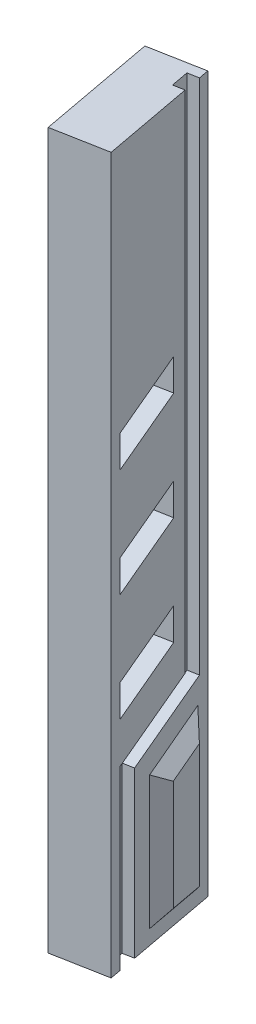
ISO-10303-21;
HEADER;
FILE_DESCRIPTION(('STEP AP214'),'2;1');
FILE_NAME('part.step','',(''),(''),'','','');
FILE_SCHEMA(('AUTOMOTIVE_DESIGN { 1 0 10303 214 1 1 1 1 }'));
ENDSEC;
DATA;
#1=APPLICATION_CONTEXT('core data for automotive mechanical design processes');
#2=APPLICATION_PROTOCOL_DEFINITION('international standard','automotive_design',2000,#1);
#3=PRODUCT_CONTEXT('',#1,'mechanical');
#4=PRODUCT('Part','Part','',(#3));
#5=PRODUCT_RELATED_PRODUCT_CATEGORY('part','',(#4));
#6=PRODUCT_DEFINITION_FORMATION('','',#4);
#7=PRODUCT_DEFINITION_CONTEXT('part definition',#1,'design');
#8=PRODUCT_DEFINITION('design','',#6,#7);
#9=PRODUCT_DEFINITION_SHAPE('','',#8);
#10=(LENGTH_UNIT() NAMED_UNIT(*) SI_UNIT(.MILLI.,.METRE.));
#11=(NAMED_UNIT(*) PLANE_ANGLE_UNIT() SI_UNIT($,.RADIAN.));
#12=(NAMED_UNIT(*) SI_UNIT($,.STERADIAN.) SOLID_ANGLE_UNIT());
#13=UNCERTAINTY_MEASURE_WITH_UNIT(LENGTH_MEASURE(1.E-05),#10,'distance_accuracy_value','');
#14=(GEOMETRIC_REPRESENTATION_CONTEXT(3) GLOBAL_UNCERTAINTY_ASSIGNED_CONTEXT((#13)) GLOBAL_UNIT_ASSIGNED_CONTEXT((#10,
#11,#12)) REPRESENTATION_CONTEXT('',''));
#15=CARTESIAN_POINT('',(0.,0.,0.));
#16=DIRECTION('',(0.,0.,1.));
#17=DIRECTION('',(1.,0.,0.));
#18=AXIS2_PLACEMENT_3D('',#15,#16,#17);
#19=CARTESIAN_POINT('',(-10.3753108958945,0.,1.93626512346388));
#20=DIRECTION('',(0.983028102298964,0.,-0.183455035609539));
#21=DIRECTION('',(-0.183455035609539,0.,-0.983028102298964));
#22=AXIS2_PLACEMENT_3D('',#19,#20,#21);
#23=PLANE('',#22);
#24=DIRECTION('',(0.,-1.,0.));
#25=VECTOR('',#24,1.);
#26=CARTESIAN_POINT('',(0.808929898637114,-71.6263536806701,61.8660619119441));
#27=LINE('',#26,#25);
#28=CARTESIAN_POINT('',(0.808929898637114,-71.6263536806701,61.8660619119441));
#29=VERTEX_POINT('',#28);
#30=CARTESIAN_POINT('',(0.808929898637114,-75.3266931643423,61.8660619119441));
#31=VERTEX_POINT('',#30);
#32=EDGE_CURVE('E362',#29,#31,#27,.T.);
#33=ORIENTED_EDGE('',*,*,#32,.F.);
#34=DIRECTION('',(0.169408129616689,-0.38376367434726,0.907758959124759));
#35=VECTOR('',#34,1.);
#36=CARTESIAN_POINT('',(0.501452632733804,-70.929819189626,60.2184713064492));
#37=LINE('',#36,#35);
#38=CARTESIAN_POINT('',(0.501452632733804,-70.929819189626,60.2184713064492));
#39=VERTEX_POINT('',#38);
#40=EDGE_CURVE('E291',#39,#29,#37,.T.);
#41=ORIENTED_EDGE('',*,*,#40,.F.);
#42=DIRECTION('',(0.,1.,0.));
#43=VECTOR('',#42,1.);
#44=CARTESIAN_POINT('',(0.501452632733804,-75.3266931643423,60.2184713064492));
#45=LINE('',#44,#43);
#46=CARTESIAN_POINT('',(0.5014526327338,-75.3266931643423,60.2184713064492));
#47=VERTEX_POINT('',#46);
#48=EDGE_CURVE('E367',#47,#39,#45,.T.);
#49=ORIENTED_EDGE('',*,*,#48,.F.);
#50=DIRECTION('',(-0.183455035609539,0.,-0.983028102298964));
#51=VECTOR('',#50,1.);
#52=CARTESIAN_POINT('',(0.808929898637114,-75.3266931643423,61.8660619119441));
#53=LINE('',#52,#51);
#54=EDGE_CURVE('E364',#31,#47,#53,.T.);
#55=ORIENTED_EDGE('',*,*,#54,.F.);
#56=EDGE_LOOP('',(#33,#41,#49,#55));
#57=FACE_BOUND('',#56,.T.);
#58=DIRECTION('',(0.,1.,0.));
#59=VECTOR('',#58,1.);
#60=CARTESIAN_POINT('',(0.438001001913638,-55.8609439533743,59.8784711749419));
#61=LINE('',#60,#59);
#62=CARTESIAN_POINT('',(0.438001001913636,-75.7345738792723,59.8784711749419));
#63=VERTEX_POINT('',#62);
#64=CARTESIAN_POINT('',(0.438001001913638,-55.8609439533743,59.8784711749419));
#65=VERTEX_POINT('',#64);
#66=EDGE_CURVE('E235',#63,#65,#61,.T.);
#67=ORIENTED_EDGE('',*,*,#66,.T.);
#68=DIRECTION('',(0.183455035609539,0.,0.983028102298964));
#69=VECTOR('',#68,1.);
#70=CARTESIAN_POINT('',(1.05418094169782,-55.8609439533743,63.1802186296694));
#71=LINE('',#70,#69);
#72=CARTESIAN_POINT('',(0.49073907438147,-55.8609439533743,60.161063621231));
#73=VERTEX_POINT('',#72);
#74=EDGE_CURVE('E241',#65,#73,#71,.T.);
#75=ORIENTED_EDGE('',*,*,#74,.T.);
#76=DIRECTION('',(0.,1.,0.));
#77=VECTOR('',#76,1.);
#78=CARTESIAN_POINT('',(0.49073907438147,-55.7109439533743,60.161063621231));
#79=LINE('',#78,#77);
#80=CARTESIAN_POINT('',(0.49073907438147,-70.2342206230719,60.161063621231));
#81=VERTEX_POINT('',#80);
#82=EDGE_CURVE('E392',#81,#73,#79,.T.);
#83=ORIENTED_EDGE('',*,*,#82,.F.);
#84=DIRECTION('',(-0.169825322901351,0.378245230076341,-0.909994453623728));
#85=VECTOR('',#84,1.);
#86=CARTESIAN_POINT('',(0.49073907438147,-70.2342206230719,60.161063621231));
#87=LINE('',#86,#85);
#88=CARTESIAN_POINT('',(0.904727538597954,-71.1562807682922,62.3793853642142));
#89=VERTEX_POINT('',#88);
#90=EDGE_CURVE('E415',#89,#81,#87,.T.);
#91=ORIENTED_EDGE('',*,*,#90,.F.);
#92=DIRECTION('',(0.,1.,0.));
#93=VECTOR('',#92,1.);
#94=CARTESIAN_POINT('',(0.904727538597954,-71.1562807682922,62.3793853642142));
#95=LINE('',#94,#93);
#96=CARTESIAN_POINT('',(0.904727538597952,-75.7345738792723,62.3793853642142));
#97=VERTEX_POINT('',#96);
#98=EDGE_CURVE('E413',#97,#89,#95,.T.);
#99=ORIENTED_EDGE('',*,*,#98,.F.);
#100=DIRECTION('',(-0.183455035609539,0.,-0.983028102298964));
#101=VECTOR('',#100,1.);
#102=CARTESIAN_POINT('',(1.05418094169782,-75.7345738792723,63.1802186296694));
#103=LINE('',#102,#101);
#104=EDGE_CURVE('E236',#97,#63,#103,.T.);
#105=ORIENTED_EDGE('',*,*,#104,.T.);
#106=EDGE_LOOP('',(#67,#75,#83,#91,#99,#105));
#107=FACE_BOUND('',#106,.T.);
#108=ADVANCED_FACE('F35',(#57,#107),#23,.T.);
#109=DIRECTION('',(-0.169825322901351,0.378245230076339,-0.909994453623729));
#110=VECTOR('',#109,1.);
#111=CARTESIAN_POINT('',(0.655122241442286,-68.9254349126623,61.0418967486989));
#112=LINE('',#111,#110);
#113=CARTESIAN_POINT('',(0.996455056402728,-69.6856720016994,62.8708994153637));
#114=VERTEX_POINT('',#113);
#115=CARTESIAN_POINT('',(0.655122241442282,-68.9254349126623,61.0418967486989));
#116=VERTEX_POINT('',#115);
#117=EDGE_CURVE('E278',#114,#116,#112,.T.);
#118=ORIENTED_EDGE('',*,*,#117,.F.);
#119=DIRECTION('',(0.,-1.,0.));
#120=VECTOR('',#119,1.);
#121=CARTESIAN_POINT('',(0.996455056402728,-69.6856720016994,62.8708994153637));
#122=LINE('',#121,#120);
#123=CARTESIAN_POINT('',(0.996455056402728,-68.7984489033402,62.8708994153637));
#124=VERTEX_POINT('',#123);
#125=EDGE_CURVE('E268',#124,#114,#122,.T.);
#126=ORIENTED_EDGE('',*,*,#125,.F.);
#127=DIRECTION('',(0.169825322901351,-0.378245230076339,0.909994453623729));
#128=VECTOR('',#127,1.);
#129=CARTESIAN_POINT('',(0.996455056402728,-68.7984489033402,62.8708994153637));
#130=LINE('',#129,#128);
#131=CARTESIAN_POINT('',(0.655122241442286,-68.0382118143031,61.0418967486989));
#132=VERTEX_POINT('',#131);
#133=EDGE_CURVE('E284',#132,#124,#130,.T.);
#134=ORIENTED_EDGE('',*,*,#133,.F.);
#135=DIRECTION('',(0.,1.,0.));
#136=VECTOR('',#135,1.);
#137=CARTESIAN_POINT('',(0.655122241442286,-68.0382118143031,61.0418967486989));
#138=LINE('',#137,#136);
#139=EDGE_CURVE('E280',#116,#132,#138,.T.);
#140=ORIENTED_EDGE('',*,*,#139,.F.);
#141=EDGE_LOOP('',(#118,#126,#134,#140));
#142=FACE_BOUND('',#141,.T.);
#143=DIRECTION('',(0.,-1.,0.));
#144=VECTOR('',#143,1.);
#145=CARTESIAN_POINT('',(0.996455056402728,-66.6856720016994,62.8708994153637));
#146=LINE('',#145,#144);
#147=CARTESIAN_POINT('',(0.996455056402728,-65.7984489033402,62.8708994153637));
#148=VERTEX_POINT('',#147);
#149=CARTESIAN_POINT('',(0.996455056402723,-66.6856720016994,62.8708994153637));
#150=VERTEX_POINT('',#149);
#151=EDGE_CURVE('E312',#148,#150,#146,.T.);
#152=ORIENTED_EDGE('',*,*,#151,.F.);
#153=DIRECTION('',(0.169825322901351,-0.378245230076339,0.909994453623729));
#154=VECTOR('',#153,1.);
#155=CARTESIAN_POINT('',(0.996455056402728,-65.7984489033402,62.8708994153637));
#156=LINE('',#155,#154);
#157=CARTESIAN_POINT('',(0.655122241442286,-65.0382118143031,61.0418967486989));
#158=VERTEX_POINT('',#157);
#159=EDGE_CURVE('E302',#158,#148,#156,.T.);
#160=ORIENTED_EDGE('',*,*,#159,.F.);
#161=DIRECTION('',(0.,1.,0.));
#162=VECTOR('',#161,1.);
#163=CARTESIAN_POINT('',(0.655122241442286,-65.0382118143031,61.0418967486989));
#164=LINE('',#163,#162);
#165=CARTESIAN_POINT('',(0.655122241442286,-65.9254349126623,61.0418967486989));
#166=VERTEX_POINT('',#165);
#167=EDGE_CURVE('E318',#166,#158,#164,.T.);
#168=ORIENTED_EDGE('',*,*,#167,.F.);
#169=DIRECTION('',(-0.169825322901351,0.378245230076339,-0.909994453623729));
#170=VECTOR('',#169,1.);
#171=CARTESIAN_POINT('',(0.655122241442286,-65.9254349126623,61.0418967486989));
#172=LINE('',#171,#170);
#173=EDGE_CURVE('E314',#150,#166,#172,.T.);
#174=ORIENTED_EDGE('',*,*,#173,.F.);
#175=EDGE_LOOP('',(#152,#160,#168,#174));
#176=FACE_BOUND('',#175,.T.);
#177=DIRECTION('',(0.,-1.,0.));
#178=VECTOR('',#177,1.);
#179=CARTESIAN_POINT('',(0.996455056402726,-63.6856720016994,62.8708994153637));
#180=LINE('',#179,#178);
#181=CARTESIAN_POINT('',(0.996455056402726,-62.7984489033402,62.8708994153637));
#182=VERTEX_POINT('',#181);
#183=CARTESIAN_POINT('',(0.996455056402726,-63.6856720016994,62.8708994153637));
#184=VERTEX_POINT('',#183);
#185=EDGE_CURVE('E263',#182,#184,#180,.T.);
#186=ORIENTED_EDGE('',*,*,#185,.F.);
#187=DIRECTION('',(0.169825322901351,-0.378245230076335,0.909994453623731));
#188=VECTOR('',#187,1.);
#189=CARTESIAN_POINT('',(0.996455056402726,-62.7984489033402,62.8708994153637));
#190=LINE('',#189,#188);
#191=CARTESIAN_POINT('',(0.655122241442284,-62.0382118143031,61.0418967486989));
#192=VERTEX_POINT('',#191);
#193=EDGE_CURVE('E334',#192,#182,#190,.T.);
#194=ORIENTED_EDGE('',*,*,#193,.F.);
#195=DIRECTION('',(0.,1.,0.));
#196=VECTOR('',#195,1.);
#197=CARTESIAN_POINT('',(0.655122241442284,-62.0382118143031,61.0418967486989));
#198=LINE('',#197,#196);
#199=CARTESIAN_POINT('',(0.655122241442284,-62.9254349126623,61.0418967486989));
#200=VERTEX_POINT('',#199);
#201=EDGE_CURVE('E348',#200,#192,#198,.T.);
#202=ORIENTED_EDGE('',*,*,#201,.F.);
#203=DIRECTION('',(-0.16982532290135,0.378245230076338,-0.90999445362373));
#204=VECTOR('',#203,1.);
#205=CARTESIAN_POINT('',(0.655122241442284,-62.9254349126623,61.0418967486989));
#206=LINE('',#205,#204);
#207=EDGE_CURVE('E345',#184,#200,#206,.T.);
#208=ORIENTED_EDGE('',*,*,#207,.F.);
#209=EDGE_LOOP('',(#186,#194,#202,#208));
#210=FACE_BOUND('',#209,.T.);
#211=DIRECTION('',(0.,-1.,0.));
#212=VECTOR('',#211,1.);
#213=CARTESIAN_POINT('',(0.58246659218624,-55.7109439533743,60.6525776723805));
#214=LINE('',#213,#212);
#215=CARTESIAN_POINT('',(0.582466592186239,-55.8609439533743,60.6525776723805));
#216=VERTEX_POINT('',#215);
#217=CARTESIAN_POINT('',(0.58246659218624,-69.8983930753657,60.6525776723805));
#218=VERTEX_POINT('',#217);
#219=EDGE_CURVE('E372',#216,#218,#214,.T.);
#220=ORIENTED_EDGE('',*,*,#219,.F.);
#221=CARTESIAN_POINT('',(1.05418094169782,-55.8609439533743,63.1802186296694));
#222=VERTEX_POINT('',#221);
#223=EDGE_CURVE('E240',#216,#222,#71,.T.);
#224=ORIENTED_EDGE('',*,*,#223,.T.);
#225=DIRECTION('',(0.,-1.,0.));
#226=VECTOR('',#225,1.);
#227=CARTESIAN_POINT('',(1.05418094169782,-55.8609439533743,63.1802186296694));
#228=LINE('',#227,#226);
#229=CARTESIAN_POINT('',(1.05418094169782,-75.7345738792723,63.1802186296694));
#230=VERTEX_POINT('',#229);
#231=EDGE_CURVE('E221',#222,#230,#228,.T.);
#232=ORIENTED_EDGE('',*,*,#231,.T.);
#233=CARTESIAN_POINT('',(0.996455056402723,-75.7345738792723,62.8708994153637));
#234=VERTEX_POINT('',#233);
#235=EDGE_CURVE('E228',#230,#234,#103,.T.);
#236=ORIENTED_EDGE('',*,*,#235,.T.);
#237=DIRECTION('',(0.,-1.,0.));
#238=VECTOR('',#237,1.);
#239=CARTESIAN_POINT('',(0.996455056402723,-70.820453220586,62.8708994153637));
#240=LINE('',#239,#238);
#241=CARTESIAN_POINT('',(0.996455056402723,-70.820453220586,62.8708994153637));
#242=VERTEX_POINT('',#241);
#243=EDGE_CURVE('E411',#242,#234,#240,.T.);
#244=ORIENTED_EDGE('',*,*,#243,.F.);
#245=DIRECTION('',(0.16982532290135,-0.37824523007634,0.909994453623729));
#246=VECTOR('',#245,1.);
#247=CARTESIAN_POINT('',(0.58246659218624,-69.8983930753657,60.6525776723805));
#248=LINE('',#247,#246);
#249=EDGE_CURVE('E408',#218,#242,#248,.T.);
#250=ORIENTED_EDGE('',*,*,#249,.F.);
#251=EDGE_LOOP('',(#220,#224,#232,#236,#244,#250));
#252=FACE_BOUND('',#251,.T.);
#253=ADVANCED_FACE('F239',(#142,#176,#210,#252),#23,.T.);
#254=CARTESIAN_POINT('',(0.195830643691781,-55.7109439533743,60.2161001319139));
#255=DIRECTION('',(-0.183455035609539,0.,-0.983028102298964));
#256=DIRECTION('',(-0.983028102298964,0.,0.183455035609539));
#257=AXIS2_PLACEMENT_3D('',#254,#255,#256);
#258=PLANE('',#257);
#259=DIRECTION('',(0.983028102298964,0.,-0.183455035609539));
#260=VECTOR('',#259,1.);
#261=CARTESIAN_POINT('',(0.195830643691781,-55.8609439533743,60.2161001319139));
#262=LINE('',#261,#260);
#263=CARTESIAN_POINT('',(0.195830643691776,-55.8609439533743,60.2161001319139));
#264=VERTEX_POINT('',#263);
#265=EDGE_CURVE('E259',#264,#73,#262,.T.);
#266=ORIENTED_EDGE('',*,*,#265,.F.);
#267=DIRECTION('',(0.,1.,0.));
#268=VECTOR('',#267,1.);
#269=CARTESIAN_POINT('',(0.195830643691781,-55.7109439533743,60.2161001319139));
#270=LINE('',#269,#268);
#271=CARTESIAN_POINT('',(0.195830643691781,-70.2342206230719,60.2161001319139));
#272=VERTEX_POINT('',#271);
#273=EDGE_CURVE('E403',#272,#264,#270,.T.);
#274=ORIENTED_EDGE('',*,*,#273,.F.);
#275=DIRECTION('',(0.983028102298964,0.,-0.183455035609539));
#276=VECTOR('',#275,1.);
#277=CARTESIAN_POINT('',(0.195830643691781,-70.2342206230719,60.2161001319139));
#278=LINE('',#277,#276);
#279=EDGE_CURVE('E420',#272,#81,#278,.T.);
#280=ORIENTED_EDGE('',*,*,#279,.T.);
#281=ORIENTED_EDGE('',*,*,#82,.T.);
#282=EDGE_LOOP('',(#266,#274,#280,#281));
#283=FACE_BOUND('',#282,.T.);
#284=ADVANCED_FACE('F442',(#283),#258,.F.);
#285=CARTESIAN_POINT('',(0.609819107908265,-71.1562807682922,62.4344218748971));
#286=DIRECTION('',(-0.183455035609539,0.,-0.983028102298964));
#287=DIRECTION('',(-0.983028102298964,0.,0.183455035609539));
#288=AXIS2_PLACEMENT_3D('',#285,#286,#287);
#289=PLANE('',#288);
#290=DIRECTION('',(-0.983028102298964,0.,0.183455035609539));
#291=VECTOR('',#290,1.);
#292=CARTESIAN_POINT('',(0.609819107908264,-75.7345738792723,62.4344218748971));
#293=LINE('',#292,#291);
#294=CARTESIAN_POINT('',(0.609819107908265,-75.7345738792723,62.4344218748971));
#295=VERTEX_POINT('',#294);
#296=EDGE_CURVE('E58',#97,#295,#293,.T.);
#297=ORIENTED_EDGE('',*,*,#296,.F.);
#298=ORIENTED_EDGE('',*,*,#98,.T.);
#299=DIRECTION('',(0.983028102298964,0.,-0.183455035609539));
#300=VECTOR('',#299,1.);
#301=CARTESIAN_POINT('',(0.609819107908265,-71.1562807682922,62.4344218748971));
#302=LINE('',#301,#300);
#303=CARTESIAN_POINT('',(0.609819107908265,-71.1562807682922,62.4344218748971));
#304=VERTEX_POINT('',#303);
#305=EDGE_CURVE('E423',#304,#89,#302,.T.);
#306=ORIENTED_EDGE('',*,*,#305,.F.);
#307=DIRECTION('',(0.,1.,0.));
#308=VECTOR('',#307,1.);
#309=CARTESIAN_POINT('',(0.609819107908265,-71.1562807682922,62.4344218748971));
#310=LINE('',#309,#308);
#311=EDGE_CURVE('E398',#295,#304,#310,.T.);
#312=ORIENTED_EDGE('',*,*,#311,.F.);
#313=EDGE_LOOP('',(#297,#298,#306,#312));
#314=FACE_BOUND('',#313,.T.);
#315=ADVANCED_FACE('F462',(#314),#289,.F.);
#316=CARTESIAN_POINT('',(0.701546625713034,-70.820453220586,62.9259359260466));
#317=DIRECTION('',(0.183455035609539,0.,0.983028102298964));
#318=DIRECTION('',(0.983028102298964,0.,-0.183455035609539));
#319=AXIS2_PLACEMENT_3D('',#316,#317,#318);
#320=PLANE('',#319);
#321=DIRECTION('',(0.983028102298964,0.,-0.183455035609539));
#322=VECTOR('',#321,1.);
#323=CARTESIAN_POINT('',(0.701546625713033,-75.7345738792723,62.9259359260466));
#324=LINE('',#323,#322);
#325=CARTESIAN_POINT('',(0.701546625713036,-75.7345738792723,62.9259359260466));
#326=VERTEX_POINT('',#325);
#327=EDGE_CURVE('E231',#326,#234,#324,.T.);
#328=ORIENTED_EDGE('',*,*,#327,.F.);
#329=DIRECTION('',(0.,-1.,0.));
#330=VECTOR('',#329,1.);
#331=CARTESIAN_POINT('',(0.701546625713034,-70.820453220586,62.9259359260466));
#332=LINE('',#331,#330);
#333=CARTESIAN_POINT('',(0.701546625713034,-70.820453220586,62.9259359260466));
#334=VERTEX_POINT('',#333);
#335=EDGE_CURVE('E395',#334,#326,#332,.T.);
#336=ORIENTED_EDGE('',*,*,#335,.F.);
#337=DIRECTION('',(0.983028102298964,0.,-0.183455035609539));
#338=VECTOR('',#337,1.);
#339=CARTESIAN_POINT('',(0.701546625713034,-70.820453220586,62.9259359260466));
#340=LINE('',#339,#338);
#341=EDGE_CURVE('E426',#334,#242,#340,.T.);
#342=ORIENTED_EDGE('',*,*,#341,.T.);
#343=ORIENTED_EDGE('',*,*,#243,.T.);
#344=EDGE_LOOP('',(#328,#336,#342,#343));
#345=FACE_BOUND('',#344,.T.);
#346=ADVANCED_FACE('F464',(#345),#320,.F.);
#347=CARTESIAN_POINT('',(0.28755816149655,-55.7109439533743,60.7076141830634));
#348=DIRECTION('',(0.183455035609539,0.,0.983028102298964));
#349=DIRECTION('',(0.983028102298964,0.,-0.183455035609539));
#350=AXIS2_PLACEMENT_3D('',#347,#348,#349);
#351=PLANE('',#350);
#352=DIRECTION('',(-0.983028102298964,0.,0.183455035609539));
#353=VECTOR('',#352,1.);
#354=CARTESIAN_POINT('',(0.28755816149655,-55.8609439533743,60.7076141830634));
#355=LINE('',#354,#353);
#356=CARTESIAN_POINT('',(0.287558161496546,-55.8609439533743,60.7076141830634));
#357=VERTEX_POINT('',#356);
#358=EDGE_CURVE('E257',#216,#357,#355,.T.);
#359=ORIENTED_EDGE('',*,*,#358,.F.);
#360=ORIENTED_EDGE('',*,*,#219,.T.);
#361=DIRECTION('',(0.983028102298964,0.,-0.183455035609539));
#362=VECTOR('',#361,1.);
#363=CARTESIAN_POINT('',(0.28755816149655,-69.8983930753657,60.7076141830634));
#364=LINE('',#363,#362);
#365=CARTESIAN_POINT('',(0.28755816149655,-69.8983930753657,60.7076141830634));
#366=VERTEX_POINT('',#365);
#367=EDGE_CURVE('E406',#366,#218,#364,.T.);
#368=ORIENTED_EDGE('',*,*,#367,.F.);
#369=DIRECTION('',(0.,-1.,0.));
#370=VECTOR('',#369,1.);
#371=CARTESIAN_POINT('',(0.28755816149655,-55.7109439533743,60.7076141830634));
#372=LINE('',#371,#370);
#373=EDGE_CURVE('E389',#357,#366,#372,.T.);
#374=ORIENTED_EDGE('',*,*,#373,.F.);
#375=EDGE_LOOP('',(#359,#360,#368,#374));
#376=FACE_BOUND('',#375,.T.);
#377=ADVANCED_FACE('F470',(#376),#351,.F.);
#378=CARTESIAN_POINT('',(-10.6702193265842,0.,1.99130163414676));
#379=DIRECTION('',(-0.983028102298964,0.,0.18345503560954));
#380=DIRECTION('',(0.18345503560954,0.,0.983028102298964));
#381=AXIS2_PLACEMENT_3D('',#378,#379,#380);
#382=PLANE('',#381);
#383=DIRECTION('',(-0.18345503560954,0.,-0.983028102298964));
#384=VECTOR('',#383,1.);
#385=CARTESIAN_POINT('',(-10.6702193265842,-55.8609439533743,1.99130163414676));
#386=LINE('',#385,#384);
#387=EDGE_CURVE('E431',#357,#264,#386,.T.);
#388=ORIENTED_EDGE('',*,*,#387,.F.);
#389=ORIENTED_EDGE('',*,*,#373,.T.);
#390=DIRECTION('',(0.16982532290135,-0.37824523007634,0.909994453623729));
#391=VECTOR('',#390,1.);
#392=CARTESIAN_POINT('',(0.28755816149655,-69.8983930753657,60.7076141830634));
#393=LINE('',#392,#391);
#394=EDGE_CURVE('E391',#366,#334,#393,.T.);
#395=ORIENTED_EDGE('',*,*,#394,.T.);
#396=ORIENTED_EDGE('',*,*,#335,.T.);
#397=DIRECTION('',(0.18345503560954,0.,0.983028102298964));
#398=VECTOR('',#397,1.);
#399=CARTESIAN_POINT('',(-10.6702193265842,-75.7345738792723,1.99130163414676));
#400=LINE('',#399,#398);
#401=EDGE_CURVE('E422',#295,#326,#400,.T.);
#402=ORIENTED_EDGE('',*,*,#401,.F.);
#403=ORIENTED_EDGE('',*,*,#311,.T.);
#404=DIRECTION('',(-0.169825322901351,0.378245230076341,-0.909994453623728));
#405=VECTOR('',#404,1.);
#406=CARTESIAN_POINT('',(0.195830643691781,-70.2342206230719,60.2161001319139));
#407=LINE('',#406,#405);
#408=EDGE_CURVE('E400',#304,#272,#407,.T.);
#409=ORIENTED_EDGE('',*,*,#408,.T.);
#410=ORIENTED_EDGE('',*,*,#273,.T.);
#411=EDGE_LOOP('',(#388,#389,#395,#396,#402,#403,#409,#410));
#412=FACE_BOUND('',#411,.T.);
#413=ADVANCED_FACE('F444',(#412),#382,.F.);
#414=CARTESIAN_POINT('',(0.195830643691781,-70.2342206230719,60.2161001319139));
#415=DIRECTION('',(-0.0693909921527936,-0.925705431508585,-0.371825690725581));
#416=DIRECTION('',(0.,0.372724127346013,-0.927942199112721));
#417=AXIS2_PLACEMENT_3D('',#414,#415,#416);
#418=PLANE('',#417);
#419=ORIENTED_EDGE('',*,*,#90,.T.);
#420=ORIENTED_EDGE('',*,*,#279,.F.);
#421=ORIENTED_EDGE('',*,*,#408,.F.);
#422=ORIENTED_EDGE('',*,*,#305,.T.);
#423=EDGE_LOOP('',(#419,#420,#421,#422));
#424=FACE_BOUND('',#423,.T.);
#425=ADVANCED_FACE('F449',(#424),#418,.F.);
#426=CARTESIAN_POINT('',(0.28755816149655,-69.8983930753657,60.7076141830634));
#427=DIRECTION('',(0.0693909921527934,0.925705431508585,0.37182569072558));
#428=DIRECTION('',(0.,-0.372724127346012,0.927942199112722));
#429=AXIS2_PLACEMENT_3D('',#426,#427,#428);
#430=PLANE('',#429);
#431=ORIENTED_EDGE('',*,*,#249,.T.);
#432=ORIENTED_EDGE('',*,*,#341,.F.);
#433=ORIENTED_EDGE('',*,*,#394,.F.);
#434=ORIENTED_EDGE('',*,*,#367,.T.);
#435=EDGE_LOOP('',(#431,#432,#433,#434));
#436=FACE_BOUND('',#435,.T.);
#437=ADVANCED_FACE('F487',(#436),#430,.F.);
#438=CARTESIAN_POINT('',(0.501452632733804,-70.929819189626,60.2184713064492));
#439=DIRECTION('',(0.817981363610902,0.568521101998837,0.0876940440809846));
#440=DIRECTION('',(-0.57071982508268,0.82114486009327,0.));
#441=AXIS2_PLACEMENT_3D('',#438,#439,#440);
#442=PLANE('',#441);
#443=ORIENTED_EDGE('',*,*,#40,.T.);
#444=DIRECTION('',(-0.407711410858987,0.465434438110173,0.785583979773291));
#445=VECTOR('',#444,1.);
#446=CARTESIAN_POINT('',(0.808929898637114,-71.6263536806701,61.8660619119441));
#447=LINE('',#446,#445);
#448=CARTESIAN_POINT('',(1.03339480801317,-71.8825979166379,61.4335598231368));
#449=VERTEX_POINT('',#448);
#450=EDGE_CURVE('E370',#449,#29,#447,.T.);
#451=ORIENTED_EDGE('',*,*,#450,.F.);
#452=DIRECTION('',(-0.169408129616689,0.38376367434726,-0.907758959124759));
#453=VECTOR('',#452,1.);
#454=CARTESIAN_POINT('',(0.76932739885021,-71.284400655119,60.0185772185657));
#455=LINE('',#454,#453);
#456=CARTESIAN_POINT('',(0.866804584737124,-71.5052177027166,60.5409003738908));
#457=VERTEX_POINT('',#456);
#458=EDGE_CURVE('E369',#457,#449,#455,.F.);
#459=ORIENTED_EDGE('',*,*,#458,.F.);
#460=DIRECTION('',(-0.484547398465422,0.763121289130045,-0.427620996580956));
#461=VECTOR('',#460,1.);
#462=CARTESIAN_POINT('',(0.501452632733804,-70.929819189626,60.2184713064492));
#463=LINE('',#462,#461);
#464=EDGE_CURVE('E374',#457,#39,#463,.T.);
#465=ORIENTED_EDGE('',*,*,#464,.T.);
#466=EDGE_LOOP('',(#443,#451,#459,#465));
#467=FACE_BOUND('',#466,.T.);
#468=ADVANCED_FACE('F489',(#467),#442,.T.);
#469=CARTESIAN_POINT('',(0.808929898637114,-71.6263536806701,61.8660619119441));
#470=DIRECTION('',(0.887582913588483,0.,0.460647990884341));
#471=DIRECTION('',(0.460647990884341,0.,-0.887582913588483));
#472=AXIS2_PLACEMENT_3D('',#469,#470,#471);
#473=PLANE('',#472);
#474=ORIENTED_EDGE('',*,*,#32,.T.);
#475=DIRECTION('',(-0.361811948854093,-0.618936177129699,0.697144262191461));
#476=VECTOR('',#475,1.);
#477=CARTESIAN_POINT('',(0.808929898637114,-75.3266931643423,61.8660619119441));
#478=LINE('',#477,#476);
#479=CARTESIAN_POINT('',(1.03339480801317,-74.9427106746843,61.4335598231368));
#480=VERTEX_POINT('',#479);
#481=EDGE_CURVE('E373',#480,#31,#478,.T.);
#482=ORIENTED_EDGE('',*,*,#481,.F.);
#483=DIRECTION('',(0.,1.,0.));
#484=VECTOR('',#483,1.);
#485=CARTESIAN_POINT('',(1.03339480801317,-71.6263536806701,61.4335598231368));
#486=LINE('',#485,#484);
#487=EDGE_CURVE('E384',#449,#480,#486,.F.);
#488=ORIENTED_EDGE('',*,*,#487,.F.);
#489=ORIENTED_EDGE('',*,*,#450,.T.);
#490=EDGE_LOOP('',(#474,#482,#488,#489));
#491=FACE_BOUND('',#490,.T.);
#492=ADVANCED_FACE('F495',(#491),#473,.T.);
#493=CARTESIAN_POINT('',(0.808929898637114,-75.3266931643423,61.8660619119441));
#494=DIRECTION('',(0.774636715709193,-0.615661475325658,-0.144564540863621));
#495=DIRECTION('',(0.622197427112039,0.78286037177466,0.));
#496=AXIS2_PLACEMENT_3D('',#493,#494,#495);
#497=PLANE('',#496);
#498=ORIENTED_EDGE('',*,*,#54,.T.);
#499=DIRECTION('',(-0.588905865684815,-0.6189361771297,-0.519719049104506));
#500=VECTOR('',#499,1.);
#501=CARTESIAN_POINT('',(0.501452632733804,-75.3266931643423,60.2184713064492));
#502=LINE('',#501,#500);
#503=CARTESIAN_POINT('',(0.866804584737125,-74.9427106746843,60.5409003738908));
#504=VERTEX_POINT('',#503);
#505=EDGE_CURVE('E377',#504,#47,#502,.T.);
#506=ORIENTED_EDGE('',*,*,#505,.F.);
#507=DIRECTION('',(0.183455035609539,0.,0.983028102298964));
#508=VECTOR('',#507,1.);
#509=CARTESIAN_POINT('',(1.1038383293268,-74.9427106746843,61.8110254012613));
#510=LINE('',#509,#508);
#511=EDGE_CURVE('E386',#480,#504,#510,.F.);
#512=ORIENTED_EDGE('',*,*,#511,.F.);
#513=ORIENTED_EDGE('',*,*,#481,.T.);
#514=EDGE_LOOP('',(#498,#506,#512,#513));
#515=FACE_BOUND('',#514,.T.);
#516=ADVANCED_FACE('F509',(#515),#497,.T.);
#517=CARTESIAN_POINT('',(0.501452632733804,-75.3266931643423,60.2184713064492));
#518=DIRECTION('',(0.661690517829903,0.,-0.749777072611583));
#519=DIRECTION('',(-0.749777072611583,0.,-0.661690517829903));
#520=AXIS2_PLACEMENT_3D('',#517,#518,#519);
#521=PLANE('',#520);
#522=ORIENTED_EDGE('',*,*,#48,.T.);
#523=ORIENTED_EDGE('',*,*,#464,.F.);
#524=DIRECTION('',(0.,-1.,0.));
#525=VECTOR('',#524,1.);
#526=CARTESIAN_POINT('',(0.866804584737123,-75.3266931643423,60.5409003738908));
#527=LINE('',#526,#525);
#528=EDGE_CURVE('E378',#504,#457,#527,.F.);
#529=ORIENTED_EDGE('',*,*,#528,.F.);
#530=ORIENTED_EDGE('',*,*,#505,.T.);
#531=EDGE_LOOP('',(#522,#523,#529,#530));
#532=FACE_BOUND('',#531,.T.);
#533=ADVANCED_FACE('F513',(#532),#521,.T.);
#534=CARTESIAN_POINT('',(-10.0804024652048,0.,1.88122861278101));
#535=DIRECTION('',(0.983028102298964,0.,-0.183455035609539));
#536=DIRECTION('',(-0.183455035609539,0.,-0.983028102298964));
#537=AXIS2_PLACEMENT_3D('',#534,#535,#536);
#538=PLANE('',#537);
#539=ORIENTED_EDGE('',*,*,#458,.T.);
#540=ORIENTED_EDGE('',*,*,#487,.T.);
#541=ORIENTED_EDGE('',*,*,#511,.T.);
#542=ORIENTED_EDGE('',*,*,#528,.T.);
#543=EDGE_LOOP('',(#539,#540,#541,#542));
#544=FACE_BOUND('',#543,.T.);
#545=ADVANCED_FACE('F516',(#544),#538,.T.);
#546=CARTESIAN_POINT('',(0.504941005253244,-63.6856720016994,62.9626269331685));
#547=DIRECTION('',(0.183455035609539,0.,0.983028102298964));
#548=DIRECTION('',(0.983028102298964,0.,-0.183455035609539));
#549=AXIS2_PLACEMENT_3D('',#546,#547,#548);
#550=PLANE('',#549);
#551=ORIENTED_EDGE('',*,*,#185,.T.);
#552=DIRECTION('',(0.983028102298964,0.,-0.183455035609539));
#553=VECTOR('',#552,1.);
#554=CARTESIAN_POINT('',(0.504941005253244,-63.6856720016994,62.9626269331685));
#555=LINE('',#554,#553);
#556=CARTESIAN_POINT('',(0.504941005253244,-63.6856720016994,62.9626269331685));
#557=VERTEX_POINT('',#556);
#558=EDGE_CURVE('E343',#557,#184,#555,.T.);
#559=ORIENTED_EDGE('',*,*,#558,.F.);
#560=DIRECTION('',(0.,-1.,0.));
#561=VECTOR('',#560,1.);
#562=CARTESIAN_POINT('',(0.504941005253244,-63.6856720016994,62.9626269331685));
#563=LINE('',#562,#561);
#564=CARTESIAN_POINT('',(0.504941005253244,-62.7984489033402,62.9626269331685));
#565=VERTEX_POINT('',#564);
#566=EDGE_CURVE('E330',#565,#557,#563,.T.);
#567=ORIENTED_EDGE('',*,*,#566,.F.);
#568=DIRECTION('',(0.983028102298964,0.,-0.183455035609539));
#569=VECTOR('',#568,1.);
#570=CARTESIAN_POINT('',(0.504941005253244,-62.7984489033402,62.9626269331685));
#571=LINE('',#570,#569);
#572=EDGE_CURVE('E315',#565,#182,#571,.T.);
#573=ORIENTED_EDGE('',*,*,#572,.T.);
#574=EDGE_LOOP('',(#551,#559,#567,#573));
#575=FACE_BOUND('',#574,.T.);
#576=ADVANCED_FACE('F521',(#575),#550,.F.);
#577=CARTESIAN_POINT('',(0.504941005253244,-62.7984489033402,62.9626269331685));
#578=DIRECTION('',(0.0693909921527924,0.925705431508588,0.371825690725574));
#579=DIRECTION('',(0.,-0.372724127346007,0.927942199112724));
#580=AXIS2_PLACEMENT_3D('',#577,#578,#579);
#581=PLANE('',#580);
#582=ORIENTED_EDGE('',*,*,#193,.T.);
#583=ORIENTED_EDGE('',*,*,#572,.F.);
#584=DIRECTION('',(0.169825322901351,-0.378245230076335,0.909994453623731));
#585=VECTOR('',#584,1.);
#586=CARTESIAN_POINT('',(0.504941005253244,-62.7984489033402,62.9626269331685));
#587=LINE('',#586,#585);
#588=CARTESIAN_POINT('',(0.163608190292802,-62.0382118143031,61.1336242665037));
#589=VERTEX_POINT('',#588);
#590=EDGE_CURVE('E340',#589,#565,#587,.T.);
#591=ORIENTED_EDGE('',*,*,#590,.F.);
#592=DIRECTION('',(0.983028102298964,0.,-0.183455035609539));
#593=VECTOR('',#592,1.);
#594=CARTESIAN_POINT('',(0.163608190292802,-62.0382118143031,61.1336242665037));
#595=LINE('',#594,#593);
#596=EDGE_CURVE('E354',#589,#192,#595,.T.);
#597=ORIENTED_EDGE('',*,*,#596,.T.);
#598=EDGE_LOOP('',(#582,#583,#591,#597));
#599=FACE_BOUND('',#598,.T.);
#600=ADVANCED_FACE('F525',(#599),#581,.F.);
#601=CARTESIAN_POINT('',(0.163608190292802,-62.0382118143031,61.1336242665037));
#602=DIRECTION('',(-0.183455035609539,0.,-0.983028102298964));
#603=DIRECTION('',(-0.983028102298964,0.,0.183455035609539));
#604=AXIS2_PLACEMENT_3D('',#601,#602,#603);
#605=PLANE('',#604);
#606=ORIENTED_EDGE('',*,*,#201,.T.);
#607=ORIENTED_EDGE('',*,*,#596,.F.);
#608=DIRECTION('',(0.,1.,0.));
#609=VECTOR('',#608,1.);
#610=CARTESIAN_POINT('',(0.163608190292802,-62.0382118143031,61.1336242665037));
#611=LINE('',#610,#609);
#612=CARTESIAN_POINT('',(0.163608190292802,-62.9254349126623,61.1336242665037));
#613=VERTEX_POINT('',#612);
#614=EDGE_CURVE('E337',#613,#589,#611,.T.);
#615=ORIENTED_EDGE('',*,*,#614,.F.);
#616=DIRECTION('',(0.983028102298964,0.,-0.183455035609539));
#617=VECTOR('',#616,1.);
#618=CARTESIAN_POINT('',(0.163608190292802,-62.9254349126623,61.1336242665037));
#619=LINE('',#618,#617);
#620=EDGE_CURVE('E356',#613,#200,#619,.T.);
#621=ORIENTED_EDGE('',*,*,#620,.T.);
#622=EDGE_LOOP('',(#606,#607,#615,#621));
#623=FACE_BOUND('',#622,.T.);
#624=ADVANCED_FACE('F531',(#623),#605,.F.);
#625=CARTESIAN_POINT('',(0.163608190292802,-62.9254349126623,61.1336242665037));
#626=DIRECTION('',(-0.069390992152793,-0.925705431508587,-0.371825690725577));
#627=DIRECTION('',(0.,0.37272412734601,-0.927942199112723));
#628=AXIS2_PLACEMENT_3D('',#625,#626,#627);
#629=PLANE('',#628);
#630=ORIENTED_EDGE('',*,*,#207,.T.);
#631=ORIENTED_EDGE('',*,*,#620,.F.);
#632=DIRECTION('',(-0.16982532290135,0.378245230076338,-0.90999445362373));
#633=VECTOR('',#632,1.);
#634=CARTESIAN_POINT('',(0.163608190292802,-62.9254349126623,61.1336242665037));
#635=LINE('',#634,#633);
#636=EDGE_CURVE('E333',#557,#613,#635,.T.);
#637=ORIENTED_EDGE('',*,*,#636,.F.);
#638=ORIENTED_EDGE('',*,*,#558,.T.);
#639=EDGE_LOOP('',(#630,#631,#637,#638));
#640=FACE_BOUND('',#639,.T.);
#641=ADVANCED_FACE('F527',(#640),#629,.F.);
#642=CARTESIAN_POINT('',(-10.8668249470439,0.,2.02799264126862));
#643=DIRECTION('',(-0.983028102298964,0.,0.183455035609538));
#644=DIRECTION('',(0.183455035609538,0.,0.983028102298965));
#645=AXIS2_PLACEMENT_3D('',#642,#643,#644);
#646=PLANE('',#645);
#647=ORIENTED_EDGE('',*,*,#566,.T.);
#648=ORIENTED_EDGE('',*,*,#636,.T.);
#649=ORIENTED_EDGE('',*,*,#614,.T.);
#650=ORIENTED_EDGE('',*,*,#590,.T.);
#651=EDGE_LOOP('',(#647,#648,#649,#650));
#652=FACE_BOUND('',#651,.T.);
#653=ADVANCED_FACE('F530',(#652),#646,.F.);
#654=CARTESIAN_POINT('',(0.504941005253246,-66.6856720016994,62.9626269331685));
#655=DIRECTION('',(0.183455035609539,0.,0.983028102298964));
#656=DIRECTION('',(0.983028102298964,0.,-0.183455035609539));
#657=AXIS2_PLACEMENT_3D('',#654,#655,#656);
#658=PLANE('',#657);
#659=ORIENTED_EDGE('',*,*,#151,.T.);
#660=DIRECTION('',(0.983028102298964,0.,-0.183455035609539));
#661=VECTOR('',#660,1.);
#662=CARTESIAN_POINT('',(0.504941005253246,-66.6856720016994,62.9626269331685));
#663=LINE('',#662,#661);
#664=CARTESIAN_POINT('',(0.504941005253246,-66.6856720016994,62.9626269331685));
#665=VERTEX_POINT('',#664);
#666=EDGE_CURVE('E311',#665,#150,#663,.T.);
#667=ORIENTED_EDGE('',*,*,#666,.F.);
#668=DIRECTION('',(0.,-1.,0.));
#669=VECTOR('',#668,1.);
#670=CARTESIAN_POINT('',(0.504941005253246,-66.6856720016994,62.9626269331685));
#671=LINE('',#670,#669);
#672=CARTESIAN_POINT('',(0.504941005253246,-65.7984489033402,62.9626269331685));
#673=VERTEX_POINT('',#672);
#674=EDGE_CURVE('E298',#673,#665,#671,.T.);
#675=ORIENTED_EDGE('',*,*,#674,.F.);
#676=DIRECTION('',(0.983028102298964,0.,-0.183455035609539));
#677=VECTOR('',#676,1.);
#678=CARTESIAN_POINT('',(0.504941005253246,-65.7984489033402,62.9626269331685));
#679=LINE('',#678,#677);
#680=EDGE_CURVE('E281',#673,#148,#679,.T.);
#681=ORIENTED_EDGE('',*,*,#680,.T.);
#682=EDGE_LOOP('',(#659,#667,#675,#681));
#683=FACE_BOUND('',#682,.T.);
#684=ADVANCED_FACE('F541',(#683),#658,.F.);
#685=CARTESIAN_POINT('',(0.504941005253246,-65.7984489033402,62.9626269331685));
#686=DIRECTION('',(0.0693909921527932,0.925705431508586,0.371825690725578));
#687=DIRECTION('',(0.,-0.372724127346011,0.927942199112722));
#688=AXIS2_PLACEMENT_3D('',#685,#686,#687);
#689=PLANE('',#688);
#690=ORIENTED_EDGE('',*,*,#159,.T.);
#691=ORIENTED_EDGE('',*,*,#680,.F.);
#692=DIRECTION('',(0.169825322901351,-0.378245230076339,0.909994453623729));
#693=VECTOR('',#692,1.);
#694=CARTESIAN_POINT('',(0.504941005253246,-65.7984489033402,62.9626269331685));
#695=LINE('',#694,#693);
#696=CARTESIAN_POINT('',(0.163608190292804,-65.0382118143031,61.1336242665037));
#697=VERTEX_POINT('',#696);
#698=EDGE_CURVE('E308',#697,#673,#695,.T.);
#699=ORIENTED_EDGE('',*,*,#698,.F.);
#700=DIRECTION('',(0.983028102298964,0.,-0.183455035609539));
#701=VECTOR('',#700,1.);
#702=CARTESIAN_POINT('',(0.163608190292804,-65.0382118143031,61.1336242665037));
#703=LINE('',#702,#701);
#704=EDGE_CURVE('E324',#697,#158,#703,.T.);
#705=ORIENTED_EDGE('',*,*,#704,.T.);
#706=EDGE_LOOP('',(#690,#691,#699,#705));
#707=FACE_BOUND('',#706,.T.);
#708=ADVANCED_FACE('F545',(#707),#689,.F.);
#709=CARTESIAN_POINT('',(0.163608190292804,-65.0382118143031,61.1336242665037));
#710=DIRECTION('',(-0.183455035609539,0.,-0.983028102298964));
#711=DIRECTION('',(-0.983028102298964,0.,0.183455035609539));
#712=AXIS2_PLACEMENT_3D('',#709,#710,#711);
#713=PLANE('',#712);
#714=ORIENTED_EDGE('',*,*,#167,.T.);
#715=ORIENTED_EDGE('',*,*,#704,.F.);
#716=DIRECTION('',(0.,1.,0.));
#717=VECTOR('',#716,1.);
#718=CARTESIAN_POINT('',(0.163608190292804,-65.0382118143031,61.1336242665037));
#719=LINE('',#718,#717);
#720=CARTESIAN_POINT('',(0.163608190292804,-65.9254349126623,61.1336242665037));
#721=VERTEX_POINT('',#720);
#722=EDGE_CURVE('E305',#721,#697,#719,.T.);
#723=ORIENTED_EDGE('',*,*,#722,.F.);
#724=DIRECTION('',(0.983028102298964,0.,-0.183455035609539));
#725=VECTOR('',#724,1.);
#726=CARTESIAN_POINT('',(0.163608190292804,-65.9254349126623,61.1336242665037));
#727=LINE('',#726,#725);
#728=EDGE_CURVE('E326',#721,#166,#727,.T.);
#729=ORIENTED_EDGE('',*,*,#728,.T.);
#730=EDGE_LOOP('',(#714,#715,#723,#729));
#731=FACE_BOUND('',#730,.T.);
#732=ADVANCED_FACE('F551',(#731),#713,.F.);
#733=CARTESIAN_POINT('',(0.163608190292804,-65.9254349126623,61.1336242665037));
#734=DIRECTION('',(-0.0693909921527932,-0.925705431508586,-0.371825690725578));
#735=DIRECTION('',(0.,0.372724127346011,-0.927942199112722));
#736=AXIS2_PLACEMENT_3D('',#733,#734,#735);
#737=PLANE('',#736);
#738=ORIENTED_EDGE('',*,*,#173,.T.);
#739=ORIENTED_EDGE('',*,*,#728,.F.);
#740=DIRECTION('',(-0.169825322901351,0.378245230076339,-0.909994453623729));
#741=VECTOR('',#740,1.);
#742=CARTESIAN_POINT('',(0.163608190292804,-65.9254349126623,61.1336242665037));
#743=LINE('',#742,#741);
#744=EDGE_CURVE('E301',#665,#721,#743,.T.);
#745=ORIENTED_EDGE('',*,*,#744,.F.);
#746=ORIENTED_EDGE('',*,*,#666,.T.);
#747=EDGE_LOOP('',(#738,#739,#745,#746));
#748=FACE_BOUND('',#747,.T.);
#749=ADVANCED_FACE('F547',(#748),#737,.F.);
#750=CARTESIAN_POINT('',(-10.866824947044,0.,2.02799264126864));
#751=DIRECTION('',(-0.983028102298964,0.,0.183455035609539));
#752=DIRECTION('',(0.183455035609539,0.,0.983028102298964));
#753=AXIS2_PLACEMENT_3D('',#750,#751,#752);
#754=PLANE('',#753);
#755=ORIENTED_EDGE('',*,*,#674,.T.);
#756=ORIENTED_EDGE('',*,*,#744,.T.);
#757=ORIENTED_EDGE('',*,*,#722,.T.);
#758=ORIENTED_EDGE('',*,*,#698,.T.);
#759=EDGE_LOOP('',(#755,#756,#757,#758));
#760=FACE_BOUND('',#759,.T.);
#761=ADVANCED_FACE('F550',(#760),#754,.F.);
#762=CARTESIAN_POINT('',(0.163608190292804,-68.9254349126623,61.1336242665037));
#763=DIRECTION('',(-0.0693909921527932,-0.925705431508586,-0.371825690725578));
#764=DIRECTION('',(0.,0.372724127346011,-0.927942199112722));
#765=AXIS2_PLACEMENT_3D('',#762,#763,#764);
#766=PLANE('',#765);
#767=ORIENTED_EDGE('',*,*,#117,.T.);
#768=DIRECTION('',(0.983028102298964,0.,-0.183455035609539));
#769=VECTOR('',#768,1.);
#770=CARTESIAN_POINT('',(0.163608190292804,-68.9254349126623,61.1336242665037));
#771=LINE('',#770,#769);
#772=CARTESIAN_POINT('',(0.163608190292804,-68.9254349126623,61.1336242665037));
#773=VERTEX_POINT('',#772);
#774=EDGE_CURVE('E277',#773,#116,#771,.T.);
#775=ORIENTED_EDGE('',*,*,#774,.F.);
#776=DIRECTION('',(-0.169825322901351,0.378245230076339,-0.909994453623729));
#777=VECTOR('',#776,1.);
#778=CARTESIAN_POINT('',(0.163608190292804,-68.9254349126623,61.1336242665037));
#779=LINE('',#778,#777);
#780=CARTESIAN_POINT('',(0.504941005253246,-69.6856720016994,62.9626269331685));
#781=VERTEX_POINT('',#780);
#782=EDGE_CURVE('E264',#781,#773,#779,.T.);
#783=ORIENTED_EDGE('',*,*,#782,.F.);
#784=DIRECTION('',(0.983028102298964,0.,-0.183455035609539));
#785=VECTOR('',#784,1.);
#786=CARTESIAN_POINT('',(0.504941005253246,-69.6856720016994,62.9626269331685));
#787=LINE('',#786,#785);
#788=EDGE_CURVE('E289',#781,#114,#787,.T.);
#789=ORIENTED_EDGE('',*,*,#788,.T.);
#790=EDGE_LOOP('',(#767,#775,#783,#789));
#791=FACE_BOUND('',#790,.T.);
#792=ADVANCED_FACE('F561',(#791),#766,.F.);
#793=CARTESIAN_POINT('',(0.504941005253246,-69.6856720016994,62.9626269331685));
#794=DIRECTION('',(0.183455035609539,0.,0.983028102298964));
#795=DIRECTION('',(0.983028102298964,0.,-0.183455035609539));
#796=AXIS2_PLACEMENT_3D('',#793,#794,#795);
#797=PLANE('',#796);
#798=ORIENTED_EDGE('',*,*,#125,.T.);
#799=ORIENTED_EDGE('',*,*,#788,.F.);
#800=DIRECTION('',(0.,-1.,0.));
#801=VECTOR('',#800,1.);
#802=CARTESIAN_POINT('',(0.504941005253246,-69.6856720016994,62.9626269331685));
#803=LINE('',#802,#801);
#804=CARTESIAN_POINT('',(0.504941005253246,-68.7984489033402,62.9626269331685));
#805=VERTEX_POINT('',#804);
#806=EDGE_CURVE('E274',#805,#781,#803,.T.);
#807=ORIENTED_EDGE('',*,*,#806,.F.);
#808=DIRECTION('',(0.983028102298964,0.,-0.183455035609539));
#809=VECTOR('',#808,1.);
#810=CARTESIAN_POINT('',(0.504941005253246,-68.7984489033402,62.9626269331685));
#811=LINE('',#810,#809);
#812=EDGE_CURVE('E292',#805,#124,#811,.T.);
#813=ORIENTED_EDGE('',*,*,#812,.T.);
#814=EDGE_LOOP('',(#798,#799,#807,#813));
#815=FACE_BOUND('',#814,.T.);
#816=ADVANCED_FACE('F565',(#815),#797,.F.);
#817=CARTESIAN_POINT('',(0.504941005253246,-68.7984489033402,62.9626269331685));
#818=DIRECTION('',(0.0693909921527932,0.925705431508586,0.371825690725578));
#819=DIRECTION('',(0.,-0.372724127346011,0.927942199112722));
#820=AXIS2_PLACEMENT_3D('',#817,#818,#819);
#821=PLANE('',#820);
#822=ORIENTED_EDGE('',*,*,#133,.T.);
#823=ORIENTED_EDGE('',*,*,#812,.F.);
#824=DIRECTION('',(0.169825322901351,-0.378245230076339,0.909994453623729));
#825=VECTOR('',#824,1.);
#826=CARTESIAN_POINT('',(0.504941005253246,-68.7984489033402,62.9626269331685));
#827=LINE('',#826,#825);
#828=CARTESIAN_POINT('',(0.163608190292804,-68.0382118143031,61.1336242665037));
#829=VERTEX_POINT('',#828);
#830=EDGE_CURVE('E271',#829,#805,#827,.T.);
#831=ORIENTED_EDGE('',*,*,#830,.F.);
#832=DIRECTION('',(0.983028102298964,0.,-0.183455035609539));
#833=VECTOR('',#832,1.);
#834=CARTESIAN_POINT('',(0.163608190292804,-68.0382118143031,61.1336242665037));
#835=LINE('',#834,#833);
#836=EDGE_CURVE('E294',#829,#132,#835,.T.);
#837=ORIENTED_EDGE('',*,*,#836,.T.);
#838=EDGE_LOOP('',(#822,#823,#831,#837));
#839=FACE_BOUND('',#838,.T.);
#840=ADVANCED_FACE('F571',(#839),#821,.F.);
#841=CARTESIAN_POINT('',(0.163608190292804,-68.0382118143031,61.1336242665037));
#842=DIRECTION('',(-0.183455035609539,0.,-0.983028102298964));
#843=DIRECTION('',(-0.983028102298964,0.,0.183455035609539));
#844=AXIS2_PLACEMENT_3D('',#841,#842,#843);
#845=PLANE('',#844);
#846=ORIENTED_EDGE('',*,*,#139,.T.);
#847=ORIENTED_EDGE('',*,*,#836,.F.);
#848=DIRECTION('',(0.,1.,0.));
#849=VECTOR('',#848,1.);
#850=CARTESIAN_POINT('',(0.163608190292804,-68.0382118143031,61.1336242665037));
#851=LINE('',#850,#849);
#852=EDGE_CURVE('E267',#773,#829,#851,.T.);
#853=ORIENTED_EDGE('',*,*,#852,.F.);
#854=ORIENTED_EDGE('',*,*,#774,.T.);
#855=EDGE_LOOP('',(#846,#847,#853,#854));
#856=FACE_BOUND('',#855,.T.);
#857=ADVANCED_FACE('F567',(#856),#845,.F.);
#858=CARTESIAN_POINT('',(-10.866824947044,0.,2.02799264126864));
#859=DIRECTION('',(-0.983028102298964,0.,0.183455035609539));
#860=DIRECTION('',(0.183455035609539,0.,0.983028102298964));
#861=AXIS2_PLACEMENT_3D('',#858,#859,#860);
#862=PLANE('',#861);
#863=ORIENTED_EDGE('',*,*,#782,.T.);
#864=ORIENTED_EDGE('',*,*,#852,.T.);
#865=ORIENTED_EDGE('',*,*,#830,.T.);
#866=ORIENTED_EDGE('',*,*,#806,.T.);
#867=EDGE_LOOP('',(#863,#864,#865,#866));
#868=FACE_BOUND('',#867,.T.);
#869=ADVANCED_FACE('F570',(#868),#862,.F.);
#870=CARTESIAN_POINT('',(-9.392280021076,-55.8609439533743,61.7130215310373));
#871=DIRECTION('',(-0.183455035609539,0.,-0.983028102298964));
#872=DIRECTION('',(-0.983028102298964,0.,0.183455035609539));
#873=AXIS2_PLACEMENT_3D('',#870,#871,#872);
#874=PLANE('',#873);
#875=DIRECTION('',(0.,1.,0.));
#876=VECTOR('',#875,1.);
#877=CARTESIAN_POINT('',(-1.03654115153481,0.,60.1536537283562));
#878=LINE('',#877,#876);
#879=CARTESIAN_POINT('',(-1.03654115153481,-75.7345738792723,60.1536537283562));
#880=VERTEX_POINT('',#879);
#881=CARTESIAN_POINT('',(-1.03654115153481,-55.8609439533743,60.1536537283562));
#882=VERTEX_POINT('',#881);
#883=EDGE_CURVE('E11',#880,#882,#878,.T.);
#884=ORIENTED_EDGE('',*,*,#883,.T.);
#885=DIRECTION('',(0.983028102298964,0.,-0.183455035609539));
#886=VECTOR('',#885,1.);
#887=CARTESIAN_POINT('',(-9.392280021076,-55.8609439533743,61.7130215310373));
#888=LINE('',#887,#886);
#889=EDGE_CURVE('E249',#882,#65,#888,.T.);
#890=ORIENTED_EDGE('',*,*,#889,.T.);
#891=ORIENTED_EDGE('',*,*,#66,.F.);
#892=DIRECTION('',(0.983028102298964,0.,-0.183455035609539));
#893=VECTOR('',#892,1.);
#894=CARTESIAN_POINT('',(-9.39228002107601,-75.7345738792723,61.7130215310373));
#895=LINE('',#894,#893);
#896=EDGE_CURVE('E225',#880,#63,#895,.T.);
#897=ORIENTED_EDGE('',*,*,#896,.F.);
#898=EDGE_LOOP('',(#884,#890,#891,#897));
#899=FACE_BOUND('',#898,.T.);
#900=ADVANCED_FACE('F460',(#899),#874,.T.);
#901=CARTESIAN_POINT('',(-8.77610008129182,-55.8609439533743,65.0147689857648));
#902=DIRECTION('',(0.183455035609539,0.,0.983028102298964));
#903=DIRECTION('',(0.983028102298964,0.,-0.183455035609539));
#904=AXIS2_PLACEMENT_3D('',#901,#902,#903);
#905=PLANE('',#904);
#906=DIRECTION('',(0.,-1.,0.));
#907=VECTOR('',#906,1.);
#908=CARTESIAN_POINT('',(-0.420361211750623,0.,63.4554011830837));
#909=LINE('',#908,#907);
#910=CARTESIAN_POINT('',(-0.420361211750628,-55.8609439533743,63.4554011830837));
#911=VERTEX_POINT('',#910);
#912=CARTESIAN_POINT('',(-0.420361211750628,-75.7345738792723,63.4554011830837));
#913=VERTEX_POINT('',#912);
#914=EDGE_CURVE('E43',#911,#913,#909,.T.);
#915=ORIENTED_EDGE('',*,*,#914,.T.);
#916=DIRECTION('',(0.983028102298964,0.,-0.183455035609539));
#917=VECTOR('',#916,1.);
#918=CARTESIAN_POINT('',(-8.77610008129183,-75.7345738792723,65.0147689857648));
#919=LINE('',#918,#917);
#920=EDGE_CURVE('E217',#913,#230,#919,.T.);
#921=ORIENTED_EDGE('',*,*,#920,.T.);
#922=ORIENTED_EDGE('',*,*,#231,.F.);
#923=DIRECTION('',(0.983028102298964,0.,-0.183455035609539));
#924=VECTOR('',#923,1.);
#925=CARTESIAN_POINT('',(-8.77610008129182,-55.8609439533743,65.0147689857648));
#926=LINE('',#925,#924);
#927=EDGE_CURVE('E50',#911,#222,#926,.T.);
#928=ORIENTED_EDGE('',*,*,#927,.F.);
#929=EDGE_LOOP('',(#915,#921,#922,#928));
#930=FACE_BOUND('',#929,.T.);
#931=ADVANCED_FACE('F219',(#930),#905,.T.);
#932=CARTESIAN_POINT('',(-8.77610008129182,-55.8609439533743,65.0147689857648));
#933=DIRECTION('',(0.,1.,0.));
#934=DIRECTION('',(-1.,0.,0.));
#935=AXIS2_PLACEMENT_3D('',#932,#933,#934);
#936=PLANE('',#935);
#937=DIRECTION('',(0.183455035609539,0.,0.983028102298964));
#938=VECTOR('',#937,1.);
#939=CARTESIAN_POINT('',(-11.849853049343,-55.8609439533743,2.21144767687819));
#940=LINE('',#939,#938);
#941=EDGE_CURVE('E261',#882,#911,#940,.T.);
#942=ORIENTED_EDGE('',*,*,#941,.T.);
#943=ORIENTED_EDGE('',*,*,#927,.T.);
#944=ORIENTED_EDGE('',*,*,#223,.F.);
#945=ORIENTED_EDGE('',*,*,#358,.T.);
#946=ORIENTED_EDGE('',*,*,#387,.T.);
#947=ORIENTED_EDGE('',*,*,#265,.T.);
#948=ORIENTED_EDGE('',*,*,#74,.F.);
#949=ORIENTED_EDGE('',*,*,#889,.F.);
#950=EDGE_LOOP('',(#942,#943,#944,#945,#946,#947,#948,#949));
#951=FACE_BOUND('',#950,.T.);
#952=ADVANCED_FACE('F435',(#951),#936,.T.);
#953=CARTESIAN_POINT('',(-8.77610008129183,-75.7345738792723,65.0147689857648));
#954=DIRECTION('',(0.,-1.,0.));
#955=DIRECTION('',(1.,0.,0.));
#956=AXIS2_PLACEMENT_3D('',#953,#954,#955);
#957=PLANE('',#956);
#958=DIRECTION('',(-0.183455035609539,0.,-0.983028102298964));
#959=VECTOR('',#958,1.);
#960=CARTESIAN_POINT('',(-11.849853049343,-75.7345738792723,2.21144767687819));
#961=LINE('',#960,#959);
#962=EDGE_CURVE('E255',#913,#880,#961,.T.);
#963=ORIENTED_EDGE('',*,*,#962,.T.);
#964=ORIENTED_EDGE('',*,*,#896,.T.);
#965=ORIENTED_EDGE('',*,*,#104,.F.);
#966=ORIENTED_EDGE('',*,*,#296,.T.);
#967=ORIENTED_EDGE('',*,*,#401,.T.);
#968=ORIENTED_EDGE('',*,*,#327,.T.);
#969=ORIENTED_EDGE('',*,*,#235,.F.);
#970=ORIENTED_EDGE('',*,*,#920,.F.);
#971=EDGE_LOOP('',(#963,#964,#965,#966,#967,#968,#969,#970));
#972=FACE_BOUND('',#971,.T.);
#973=ADVANCED_FACE('F229',(#972),#957,.T.);
#974=CARTESIAN_POINT('',(-11.849853049343,0.,2.21144767687819));
#975=DIRECTION('',(0.983028102298964,0.,-0.183455035609539));
#976=DIRECTION('',(-0.183455035609539,0.,-0.983028102298964));
#977=AXIS2_PLACEMENT_3D('',#974,#975,#976);
#978=PLANE('',#977);
#979=ORIENTED_EDGE('',*,*,#941,.F.);
#980=ORIENTED_EDGE('',*,*,#883,.F.);
#981=ORIENTED_EDGE('',*,*,#962,.F.);
#982=ORIENTED_EDGE('',*,*,#914,.F.);
#983=EDGE_LOOP('',(#979,#980,#981,#982));
#984=FACE_BOUND('',#983,.T.);
#985=ADVANCED_FACE('F37',(#984),#978,.F.);
#986=CLOSED_SHELL('',(#108,#253,#284,#315,#346,#377,#413,#425,#437,#468,#492,#516,#533,#545,
#576,#600,#624,#641,#653,#684,#708,#732,#749,#761,#792,#816,#840,#857,#869,#900,#931,#952,#973,#985));
#987=MANIFOLD_SOLID_BREP('B2',#986);
#988=ADVANCED_BREP_SHAPE_REPRESENTATION('',(#18,#987),#14);
#989=SHAPE_DEFINITION_REPRESENTATION(#9,#988);
ENDSEC;
END-ISO-10303-21;
